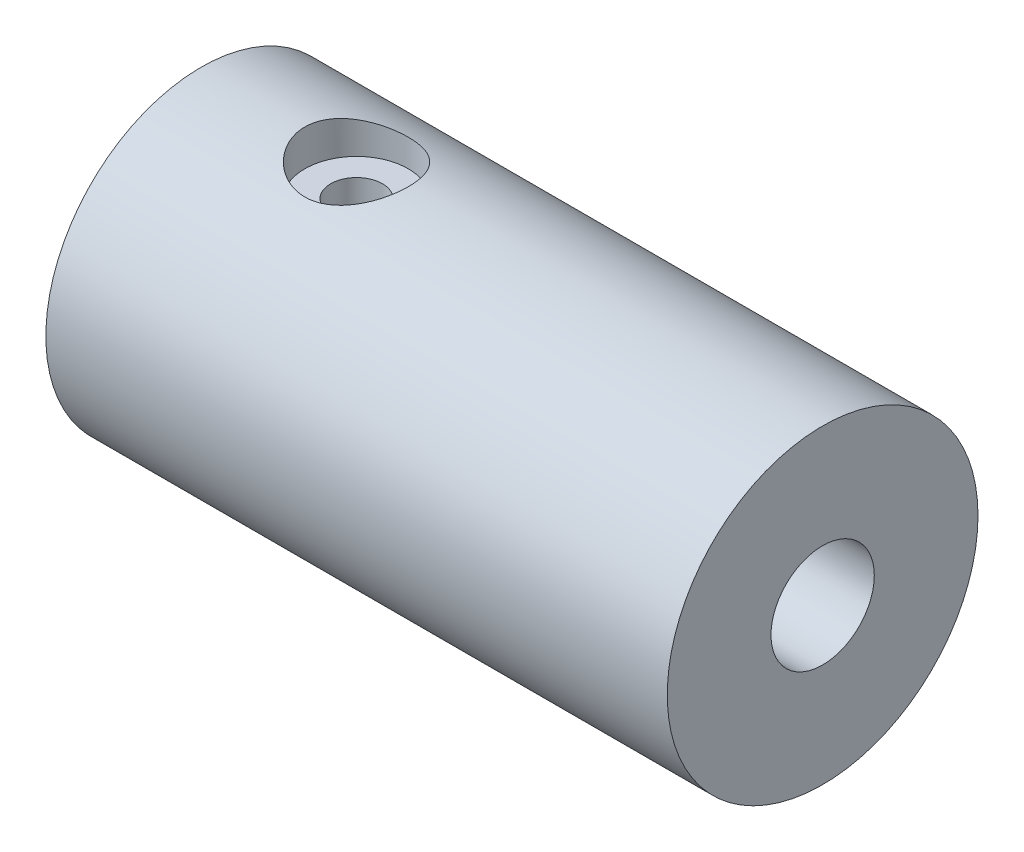
ISO-10303-21;
HEADER;
FILE_DESCRIPTION(('STEP AP214'),'2;1');
FILE_NAME('part.step','',(''),(''),'','','');
FILE_SCHEMA(('AUTOMOTIVE_DESIGN { 1 0 10303 214 1 1 1 1 }'));
ENDSEC;
DATA;
#1=APPLICATION_CONTEXT('core data for automotive mechanical design processes');
#2=APPLICATION_PROTOCOL_DEFINITION('international standard','automotive_design',2000,#1);
#3=PRODUCT_CONTEXT('',#1,'mechanical');
#4=PRODUCT('Part','Part','',(#3));
#5=PRODUCT_RELATED_PRODUCT_CATEGORY('part','',(#4));
#6=PRODUCT_DEFINITION_FORMATION('','',#4);
#7=PRODUCT_DEFINITION_CONTEXT('part definition',#1,'design');
#8=PRODUCT_DEFINITION('design','',#6,#7);
#9=PRODUCT_DEFINITION_SHAPE('','',#8);
#10=(LENGTH_UNIT() NAMED_UNIT(*) SI_UNIT(.MILLI.,.METRE.));
#11=(NAMED_UNIT(*) PLANE_ANGLE_UNIT() SI_UNIT($,.RADIAN.));
#12=(NAMED_UNIT(*) SI_UNIT($,.STERADIAN.) SOLID_ANGLE_UNIT());
#13=UNCERTAINTY_MEASURE_WITH_UNIT(LENGTH_MEASURE(1.E-05),#10,'distance_accuracy_value','');
#14=(GEOMETRIC_REPRESENTATION_CONTEXT(3) GLOBAL_UNCERTAINTY_ASSIGNED_CONTEXT((#13)) GLOBAL_UNIT_ASSIGNED_CONTEXT((#10,
#11,#12)) REPRESENTATION_CONTEXT('',''));
#15=CARTESIAN_POINT('',(0.,0.,0.));
#16=DIRECTION('',(0.,0.,1.));
#17=DIRECTION('',(1.,0.,0.));
#18=AXIS2_PLACEMENT_3D('',#15,#16,#17);
#19=CARTESIAN_POINT('',(12.,0.,0.));
#20=DIRECTION('',(-1.,0.,0.));
#21=DIRECTION('',(0.,0.,1.));
#22=AXIS2_PLACEMENT_3D('',#19,#20,#21);
#23=CYLINDRICAL_SURFACE('',#22,3.);
#24=CARTESIAN_POINT('',(3.,2.82842712474619,1.));
#25=CARTESIAN_POINT('',(2.94553182518932,2.82842694532735,1.0000002579478));
#26=CARTESIAN_POINT('',(2.89106520022848,2.83001769372806,0.99553478369814));
#27=CARTESIAN_POINT('',(2.78374557904939,2.8361757417458,0.977851131702564));
#28=CARTESIAN_POINT('',(2.73089285013606,2.8407435316722,0.964631512170673));
#29=CARTESIAN_POINT('',(2.62837310698719,2.85228203663888,0.929955485680262));
#30=CARTESIAN_POINT('',(2.57870007055312,2.8592480396464,0.908515221402));
#31=CARTESIAN_POINT('',(2.48363995145621,2.87479122017008,0.858061628442627));
#32=CARTESIAN_POINT('',(2.4382538174475,2.88336875305432,0.829046628860522));
#33=CARTESIAN_POINT('',(2.35128003766051,2.90154489405589,0.763051146442527));
#34=CARTESIAN_POINT('',(2.30988457132796,2.91116894844139,0.725824341377825));
#35=CARTESIAN_POINT('',(2.23379319877568,2.93013864801508,0.644987667214489));
#36=CARTESIAN_POINT('',(2.19909836841772,2.93948424829099,0.601376775052402));
#37=CARTESIAN_POINT('',(2.13652110267032,2.95713866921658,0.507604507964984));
#38=CARTESIAN_POINT('',(2.10884002938202,2.96541407701568,0.457301911224518));
#39=CARTESIAN_POINT('',(2.06240841487251,2.9796958677102,0.352431222987481));
#40=CARTESIAN_POINT('',(2.0436554668231,2.98570286203012,0.297864285687214));
#41=CARTESIAN_POINT('',(2.0162641453676,2.99459075431897,0.188028817433492));
#42=CARTESIAN_POINT('',(2.00729655374299,2.99757314777558,0.132850754852967));
#43=CARTESIAN_POINT('',(1.99868370663934,3.00043608218249,0.0216978748240911));
#44=CARTESIAN_POINT('',(1.99903604834758,3.00031742262891,-0.0342767335438929));
#45=CARTESIAN_POINT('',(2.00884425456603,2.99706039618736,-0.143103515193817));
#46=CARTESIAN_POINT('',(2.01794252847451,2.99404064755135,-0.195992048591667));
#47=CARTESIAN_POINT('',(2.04439298098046,2.98546967339714,-0.29944343882216));
#48=CARTESIAN_POINT('',(2.06174571897976,2.97991827631115,-0.350006137779175));
#49=CARTESIAN_POINT('',(2.10442131730613,2.96675670293292,-0.448152474842013));
#50=CARTESIAN_POINT('',(2.12984593854678,2.9591204252427,-0.495688220968998));
#51=CARTESIAN_POINT('',(2.18785970544839,2.94258393038665,-0.585924325527169));
#52=CARTESIAN_POINT('',(2.22045084332664,2.93368336200518,-0.628623334384769));
#53=CARTESIAN_POINT('',(2.29367439346074,2.9150619185089,-0.710100866551906));
#54=CARTESIAN_POINT('',(2.33461315784544,2.90532215172667,-0.748600157067556));
#55=CARTESIAN_POINT('',(2.42244872572266,2.88647335245111,-0.81827725959589));
#56=CARTESIAN_POINT('',(2.46934644571324,2.8773644173145,-0.849453943273005));
#57=CARTESIAN_POINT('',(2.56865362561542,2.86070525135531,-0.903987455042732));
#58=CARTESIAN_POINT('',(2.62113213136781,2.85317909338821,-0.927226463651049));
#59=CARTESIAN_POINT('',(2.72957139426626,2.84081650878299,-0.964443193299506));
#60=CARTESIAN_POINT('',(2.78553068122183,2.83597895501223,-0.978424795755529));
#61=CARTESIAN_POINT('',(2.89663835540062,2.8297963630207,-0.996161282090474));
#62=CARTESIAN_POINT('',(2.95170942474572,2.82830360315139,-1.00034909550575));
#63=CARTESIAN_POINT('',(3.06177614911704,2.82856672062801,-0.999605438911604));
#64=CARTESIAN_POINT('',(3.11677181602476,2.83032200792768,-0.99467562522726));
#65=CARTESIAN_POINT('',(3.22315696571116,2.83673618089379,-0.97622565155183));
#66=CARTESIAN_POINT('',(3.27460543015064,2.84129325440593,-0.963006393980555));
#67=CARTESIAN_POINT('',(3.37454360623938,2.8526855367127,-0.928713862560596));
#68=CARTESIAN_POINT('',(3.42303279159084,2.85952114934907,-0.907639196363457));
#69=CARTESIAN_POINT('',(3.51738042084694,2.87496877595718,-0.857474340738901));
#70=CARTESIAN_POINT('',(3.56310664264179,2.8836302566561,-0.828151118358487));
#71=CARTESIAN_POINT('',(3.64914605238373,2.90165768730984,-0.762585630557568));
#72=CARTESIAN_POINT('',(3.68945763866122,2.911023844438,-0.726341325498785));
#73=CARTESIAN_POINT('',(3.76552798409064,2.92995038637844,-0.645891705900322));
#74=CARTESIAN_POINT('',(3.80097439001885,2.93949843577895,-0.601387270546651));
#75=CARTESIAN_POINT('',(3.86391614234805,2.9572685161311,-0.506827291400257));
#76=CARTESIAN_POINT('',(3.89141177116243,2.96549059417695,-0.456771944864552));
#77=CARTESIAN_POINT('',(3.93742010486172,2.97964405810603,-0.352779862432295));
#78=CARTESIAN_POINT('',(3.95599127714807,2.98559030004531,-0.298871123321196));
#79=CARTESIAN_POINT('',(3.98372774206011,2.99458610837774,-0.188458465846016));
#80=CARTESIAN_POINT('',(3.9928964298805,2.99763672034018,-0.131955491953889));
#81=CARTESIAN_POINT('',(4.00126207760564,3.00041863236257,-0.0208153358600408));
#82=CARTESIAN_POINT('',(4.00090745393238,3.00029920089441,0.033784723920019));
#83=CARTESIAN_POINT('',(3.99134269185359,2.99712196519396,0.142111145000174));
#84=CARTESIAN_POINT('',(3.98213327184724,2.99406439933567,0.195837576819055));
#85=CARTESIAN_POINT('',(3.95541776542403,2.98540914954421,0.300042119432061));
#86=CARTESIAN_POINT('',(3.93804578464705,2.9798525836118,0.350558270912795));
#87=CARTESIAN_POINT('',(3.89562246890286,2.96677160704464,0.44797835093979));
#88=CARTESIAN_POINT('',(3.87056974480306,2.95924684047901,0.49488162414241));
#89=CARTESIAN_POINT('',(3.81243048789792,2.94265868828001,0.585634016308809));
#90=CARTESIAN_POINT('',(3.77908131461808,2.93354872492381,0.629306251557697));
#91=CARTESIAN_POINT('',(3.70574260884409,2.91492988791425,0.710581026272338));
#92=CARTESIAN_POINT('',(3.66575095773832,2.90542088771397,0.748181621624259));
#93=CARTESIAN_POINT('',(3.57839064441196,2.88663279827365,0.817741808833464));
#94=CARTESIAN_POINT('',(3.53079448901923,2.87737727995345,0.849422965999216));
#95=CARTESIAN_POINT('',(3.43066557310135,2.86060193316303,0.904314343299799));
#96=CARTESIAN_POINT('',(3.37813410698576,2.8530816513617,0.927526776814559));
#97=CARTESIAN_POINT('',(3.27203817597617,2.84101334230535,0.963843828206626));
#98=CARTESIAN_POINT('',(3.21862773643428,2.83634632944799,0.977357909163267));
#99=CARTESIAN_POINT('',(3.11014394948453,2.8300538361394,0.995434320161694));
#100=CARTESIAN_POINT('',(3.05507118256425,2.82842730615135,0.999999739196501));
#101=CARTESIAN_POINT('',(3.,2.82842712474619,1.));
#102=B_SPLINE_CURVE_WITH_KNOTS('',3,(#24,#25,#26,#27,#28,#29,#30,#31,#32,#33,#34,#35,#36,#37,
#38,#39,#40,#41,#42,#43,#44,#45,#46,#47,#48,#49,#50,#51,#52,#53,#54,#55,#56,#57,#58,#59,#60,#61,
#62,#63,#64,#65,#66,#67,#68,#69,#70,#71,#72,#73,#74,#75,#76,#77,#78,#79,#80,#81,#82,#83,#84,#85,
#86,#87,#88,#89,#90,#91,#92,#93,#94,#95,#96,#97,#98,#99,#100,#101),.UNSPECIFIED.,.T.,.F.,(4,2,2,
2,2,2,2,2,2,2,2,2,2,2,2,2,2,2,2,2,2,2,2,2,2,2,2,2,2,2,2,2,2,2,2,2,2,2,4),(0.,0.163200584775416,
0.32642805496888,0.489336627454544,0.652281166139158,0.821013374229397,0.989772651673595,
1.16293506139029,1.33605076382161,1.50314318760306,1.67019253297699,1.83069004820941,
1.99119844184608,2.15381654855707,2.31647991869394,2.48680174359289,2.65714979607477,
2.82992639837376,3.00263051349688,3.16754291357512,3.33242535830306,3.49164395761849,
3.65089079140018,3.81518857728788,3.979534856552,4.15178808164165,4.32403518750605,
4.49513791183924,4.66617882997229,4.82918084670708,4.99216964002854,5.15256956033502,
5.31299850756315,5.47935519513706,5.64576504425704,5.81868902729217,5.99156778259939,
6.15663212153685,6.32163947179229),.UNSPECIFIED.);
#103=CARTESIAN_POINT('',(3.,2.82842712474619,1.));
#104=VERTEX_POINT('',#103);
#105=EDGE_CURVE('E10',#104,#104,#102,.T.);
#106=ORIENTED_EDGE('',*,*,#105,.T.);
#107=EDGE_LOOP('',(#106));
#108=FACE_BOUND('',#107,.T.);
#109=CARTESIAN_POINT('',(12.,0.,0.));
#110=DIRECTION('',(1.,0.,0.));
#111=DIRECTION('',(0.,0.,-1.));
#112=AXIS2_PLACEMENT_3D('',#109,#110,#111);
#113=CIRCLE('',#112,3.);
#114=CARTESIAN_POINT('',(12.,0.,-3.));
#115=VERTEX_POINT('',#114);
#116=EDGE_CURVE('E41',#115,#115,#113,.T.);
#117=ORIENTED_EDGE('',*,*,#116,.F.);
#118=EDGE_LOOP('',(#117));
#119=FACE_BOUND('',#118,.T.);
#120=CARTESIAN_POINT('',(0.,0.,0.));
#121=DIRECTION('',(1.,0.,0.));
#122=DIRECTION('',(0.,0.,-1.));
#123=AXIS2_PLACEMENT_3D('',#120,#121,#122);
#124=CIRCLE('',#123,3.);
#125=CARTESIAN_POINT('',(0.,0.,-3.));
#126=VERTEX_POINT('',#125);
#127=EDGE_CURVE('E45',#126,#126,#124,.T.);
#128=ORIENTED_EDGE('',*,*,#127,.T.);
#129=EDGE_LOOP('',(#128));
#130=FACE_BOUND('',#129,.T.);
#131=ADVANCED_FACE('F31',(#108,#119,#130),#23,.T.);
#132=CARTESIAN_POINT('',(12.,0.,0.));
#133=DIRECTION('',(1.,0.,0.));
#134=DIRECTION('',(0.,0.,-1.));
#135=AXIS2_PLACEMENT_3D('',#132,#133,#134);
#136=PLANE('',#135);
#137=CARTESIAN_POINT('',(12.,0.,0.));
#138=DIRECTION('',(1.,0.,0.));
#139=DIRECTION('',(0.,0.,-1.));
#140=AXIS2_PLACEMENT_3D('',#137,#138,#139);
#141=CIRCLE('',#140,0.9975);
#142=CARTESIAN_POINT('',(12.,0.,-0.9975));
#143=VERTEX_POINT('',#142);
#144=EDGE_CURVE('E126',#143,#143,#141,.T.);
#145=ORIENTED_EDGE('',*,*,#144,.F.);
#146=EDGE_LOOP('',(#145));
#147=FACE_BOUND('',#146,.T.);
#148=ORIENTED_EDGE('',*,*,#116,.T.);
#149=EDGE_LOOP('',(#148));
#150=FACE_BOUND('',#149,.T.);
#151=ADVANCED_FACE('F85',(#147,#150),#136,.T.);
#152=CARTESIAN_POINT('',(0.,0.,0.));
#153=DIRECTION('',(1.,0.,0.));
#154=DIRECTION('',(0.,0.,-1.));
#155=AXIS2_PLACEMENT_3D('',#152,#153,#154);
#156=PLANE('',#155);
#157=CARTESIAN_POINT('',(0.,0.,0.));
#158=DIRECTION('',(1.,0.,0.));
#159=DIRECTION('',(0.,0.,-1.));
#160=AXIS2_PLACEMENT_3D('',#157,#158,#159);
#161=CIRCLE('',#160,1.095);
#162=CARTESIAN_POINT('',(0.,0.,-1.095));
#163=VERTEX_POINT('',#162);
#164=EDGE_CURVE('E52',#163,#163,#161,.T.);
#165=ORIENTED_EDGE('',*,*,#164,.T.);
#166=EDGE_LOOP('',(#165));
#167=FACE_BOUND('',#166,.T.);
#168=ORIENTED_EDGE('',*,*,#127,.F.);
#169=EDGE_LOOP('',(#168));
#170=FACE_BOUND('',#169,.T.);
#171=ADVANCED_FACE('F89',(#167,#170),#156,.F.);
#172=CARTESIAN_POINT('',(7.,0.,0.));
#173=DIRECTION('',(-1.,0.,0.));
#174=DIRECTION('',(0.,0.,1.));
#175=AXIS2_PLACEMENT_3D('',#172,#173,#174);
#176=CYLINDRICAL_SURFACE('',#175,1.095);
#177=CARTESIAN_POINT('',(3.,0.974179141636691,0.5));
#178=CARTESIAN_POINT('',(3.02638822465866,0.974180750905902,0.499998574725631));
#179=CARTESIAN_POINT('',(3.05281727708981,0.975267072640299,0.497897521915498));
#180=CARTESIAN_POINT('',(3.10489059713055,0.979463536568607,0.489588295549626));
#181=CARTESIAN_POINT('',(3.13053278270973,0.982578632075,0.48337006916996));
#182=CARTESIAN_POINT('',(3.18018421777573,0.990400092743193,0.467132408772783));
#183=CARTESIAN_POINT('',(3.20420043742149,0.995099070709478,0.457130595317162));
#184=CARTESIAN_POINT('',(3.25020807975825,1.00554760028066,0.433662814740286));
#185=CARTESIAN_POINT('',(3.27219970177655,1.01129704829714,0.420197189137347));
#186=CARTESIAN_POINT('',(3.31519663909436,1.02368023988367,0.389104103471685));
#187=CARTESIAN_POINT('',(3.33603240895957,1.030347550122,0.371255443402939));
#188=CARTESIAN_POINT('',(3.37454318608931,1.04354195414476,0.33236542326345));
#189=CARTESIAN_POINT('',(3.39221682325204,1.05006898607631,0.311322686513762));
#190=CARTESIAN_POINT('',(3.42482981126807,1.0626696499725,0.265250753406823));
#191=CARTESIAN_POINT('',(3.43957019851688,1.06869982143658,0.240067731665804));
#192=CARTESIAN_POINT('',(3.46452978299303,1.07920538532467,0.187253253920853));
#193=CARTESIAN_POINT('',(3.47475137157989,1.08368159983661,0.159623102259618));
#194=CARTESIAN_POINT('',(3.4897429665312,1.09033522237584,0.104486548971829));
#195=CARTESIAN_POINT('',(3.49480758907378,1.09263624503856,0.077075490876996));
#196=CARTESIAN_POINT('',(3.50030186923697,1.09513495746004,0.0217028817307119));
#197=CARTESIAN_POINT('',(3.50073381556526,1.09533368582668,-0.00625839065413278));
#198=CARTESIAN_POINT('',(3.49708640475643,1.09367181552035,-0.0597627493032363));
#199=CARTESIAN_POINT('',(3.49333329125184,1.09196013282863,-0.0853336483603504));
#200=CARTESIAN_POINT('',(3.4819927411667,1.08688379677531,-0.135435757394683));
#201=CARTESIAN_POINT('',(3.47440502019863,1.08351902081522,-0.159966890113021));
#202=CARTESIAN_POINT('',(3.45553429140653,1.07538975771208,-0.207746362255662));
#203=CARTESIAN_POINT('',(3.44419721371426,1.07060490171592,-0.230969737507867));
#204=CARTESIAN_POINT('',(3.41821026117504,1.06008668856438,-0.275244987389664));
#205=CARTESIAN_POINT('',(3.40355917227342,1.05435298401501,-0.296296062092938));
#206=CARTESIAN_POINT('',(3.3699682937268,1.04193975197126,-0.337470177317117));
#207=CARTESIAN_POINT('',(3.35077508503873,1.03522121977659,-0.357374967816835));
#208=CARTESIAN_POINT('',(3.30934039583814,1.02192545680425,-0.393789163683032));
#209=CARTESIAN_POINT('',(3.28709724308047,1.01534830584847,-0.41029669387138));
#210=CARTESIAN_POINT('',(3.23892315702262,1.00276875353325,-0.440176182427495));
#211=CARTESIAN_POINT('',(3.21286971418025,0.996806663479741,-0.453369149826456));
#212=CARTESIAN_POINT('',(3.15856928845524,0.986641578405134,-0.475088210680067));
#213=CARTESIAN_POINT('',(3.13032425632833,0.982437039790755,-0.483618401316079));
#214=CARTESIAN_POINT('',(3.07463266900552,0.976670627780376,-0.495154970001792));
#215=CARTESIAN_POINT('',(3.04727837108229,0.974938228537521,-0.498519165408573));
#216=CARTESIAN_POINT('',(2.99234706007137,0.97382296088193,-0.500695439192079));
#217=CARTESIAN_POINT('',(2.96477016043159,0.974438962809743,-0.499509706234623));
#218=CARTESIAN_POINT('',(2.91261864085833,0.977772296444088,-0.492947623422435));
#219=CARTESIAN_POINT('',(2.88798575411881,0.980309665570744,-0.487929868699457));
#220=CARTESIAN_POINT('',(2.83994310711023,0.986953078638363,-0.474347272059063));
#221=CARTESIAN_POINT('',(2.81653367652506,0.991059542949971,-0.465781479547892));
#222=CARTESIAN_POINT('',(2.7704038597193,1.00060295485654,-0.444921928119587));
#223=CARTESIAN_POINT('',(2.74776331061569,1.00609194557488,-0.43247625682193));
#224=CARTESIAN_POINT('',(2.70477086132621,1.0177209983775,-0.404351782684865));
#225=CARTESIAN_POINT('',(2.68442007665598,1.02386137499482,-0.388671414431959));
#226=CARTESIAN_POINT('',(2.64443206713985,1.03685113481661,-0.35265660612355));
#227=CARTESIAN_POINT('',(2.62507625888129,1.04370929659735,-0.332011524271317));
#228=CARTESIAN_POINT('',(2.59003571587075,1.05680235825521,-0.287626101932216));
#229=CARTESIAN_POINT('',(2.5743516318776,1.06303714753676,-0.263885213918687));
#230=CARTESIAN_POINT('',(2.5469784215689,1.07428848197202,-0.213544594717163));
#231=CARTESIAN_POINT('',(2.53533838074544,1.07928985842348,-0.186914560734961));
#232=CARTESIAN_POINT('',(2.51680505081251,1.08739703073512,-0.131782674589937));
#233=CARTESIAN_POINT('',(2.50990830779315,1.09050420570138,-0.103282201019284));
#234=CARTESIAN_POINT('',(2.50155338559932,1.09428590425815,-0.0477063605085775));
#235=CARTESIAN_POINT('',(2.49970062840743,1.09513677564247,-0.0207020382108466));
#236=CARTESIAN_POINT('',(2.5003779305783,1.09482735381087,0.0332364724075883));
#237=CARTESIAN_POINT('',(2.50290691667807,1.09366755308839,0.060170676284782));
#238=CARTESIAN_POINT('',(2.51199683969249,1.08956732123947,0.111838132922575));
#239=CARTESIAN_POINT('',(2.51835557654847,1.08671628937673,0.136614707583917));
#240=CARTESIAN_POINT('',(2.53468080406552,1.0795801115154,0.184726082984068));
#241=CARTESIAN_POINT('',(2.54464790237294,1.07529472398116,0.208060640112528));
#242=CARTESIAN_POINT('',(2.56840356791205,1.06544754710075,0.253809092731155));
#243=CARTESIAN_POINT('',(2.58234592275497,1.05983638752949,0.276132219156975));
#244=CARTESIAN_POINT('',(2.61344938725283,1.047969387116,0.318220215974281));
#245=CARTESIAN_POINT('',(2.63061191164204,1.04171326346464,0.337983955461549));
#246=CARTESIAN_POINT('',(2.66934455742386,1.02859077956524,0.376119527268074));
#247=CARTESIAN_POINT('',(2.69116301425495,1.02171707325466,0.394237451721866));
#248=CARTESIAN_POINT('',(2.73770150349477,1.00862667728491,0.426618358320279));
#249=CARTESIAN_POINT('',(2.76242345551111,1.00241042751394,0.440878769309656));
#250=CARTESIAN_POINT('',(2.81443600455831,0.991366862053861,0.4651853282357));
#251=CARTESIAN_POINT('',(2.84174739990415,0.986552326774882,0.47519305864909));
#252=CARTESIAN_POINT('',(2.89792538462866,0.979120640047078,0.490327408389469));
#253=CARTESIAN_POINT('',(2.92678640490965,0.976496115790155,0.495470412993606));
#254=CARTESIAN_POINT('',(2.9632113452157,0.974845488000344,0.49869956084772));
#255=CARTESIAN_POINT('',(2.97055736139513,0.974596201760226,0.499186696631167));
#256=CARTESIAN_POINT('',(2.98526785703132,0.974262800830847,0.49983712123877));
#257=CARTESIAN_POINT('',(2.99263233716888,0.974178692324428,0.500000397940412));
#258=CARTESIAN_POINT('',(3.,0.974179141636691,0.5));
#259=B_SPLINE_CURVE_WITH_KNOTS('',3,(#177,#178,#179,#180,#181,#182,#183,#184,#185,#186,#187,
#188,#189,#190,#191,#192,#193,#194,#195,#196,#197,#198,#199,#200,#201,#202,#203,#204,#205,#206,
#207,#208,#209,#210,#211,#212,#213,#214,#215,#216,#217,#218,#219,#220,#221,#222,#223,#224,#225,
#226,#227,#228,#229,#230,#231,#232,#233,#234,#235,#236,#237,#238,#239,#240,#241,#242,#243,#244,
#245,#246,#247,#248,#249,#250,#251,#252,#253,#254,#255,#256,#257,#258),.UNSPECIFIED.,.T.,.F.,(4,
2,2,2,2,2,2,2,2,2,2,2,2,2,2,2,2,2,2,2,2,2,2,2,2,2,2,2,2,2,2,2,2,2,2,2,2,2,2,2,4),(0.,
0.0791336960983262,0.158461327500133,0.237423981296809,0.316378852667077,0.40071826806931,
0.485094138366685,0.574022230948818,0.662903206062703,0.746360238986163,0.829776039251371,
0.90711710680244,0.984463911071841,1.06297867692159,1.14152225258381,1.22651722066574,
1.31155897814087,1.40050945355648,1.48938164203892,1.57176540413633,1.65410954189227,
1.72957022533333,1.80505113936512,1.88396702996733,1.96292120144622,2.04987831887332,
2.13685083651506,2.22484486975321,2.312774760664,2.39359649152361,2.47439842872904,
2.55126821862021,2.62815095937361,2.70854625522719,2.78897695463186,2.87612166124274,
2.96332431024127,3.05129878827609,3.13897588600085,3.16106939841147,3.18316373779863),.UNSPECIFIED.);
#260=CARTESIAN_POINT('',(3.,0.974179141636691,0.5));
#261=VERTEX_POINT('',#260);
#262=EDGE_CURVE('E60',#261,#261,#259,.T.);
#263=ORIENTED_EDGE('',*,*,#262,.T.);
#264=EDGE_LOOP('',(#263));
#265=FACE_BOUND('',#264,.T.);
#266=CARTESIAN_POINT('',(7.,0.,0.));
#267=DIRECTION('',(1.,0.,0.));
#268=DIRECTION('',(0.,0.,-1.));
#269=AXIS2_PLACEMENT_3D('',#266,#267,#268);
#270=CIRCLE('',#269,1.095);
#271=CARTESIAN_POINT('',(7.,0.,-1.095));
#272=VERTEX_POINT('',#271);
#273=EDGE_CURVE('E50',#272,#272,#270,.T.);
#274=ORIENTED_EDGE('',*,*,#273,.T.);
#275=EDGE_LOOP('',(#274));
#276=FACE_BOUND('',#275,.T.);
#277=ORIENTED_EDGE('',*,*,#164,.F.);
#278=EDGE_LOOP('',(#277));
#279=FACE_BOUND('',#278,.T.);
#280=ADVANCED_FACE('F97',(#265,#276,#279),#176,.F.);
#281=CARTESIAN_POINT('',(7.,0.,0.));
#282=DIRECTION('',(1.,0.,0.));
#283=DIRECTION('',(0.,0.,-1.));
#284=AXIS2_PLACEMENT_3D('',#281,#282,#283);
#285=PLANE('',#284);
#286=ORIENTED_EDGE('',*,*,#273,.F.);
#287=EDGE_LOOP('',(#286));
#288=FACE_BOUND('',#287,.T.);
#289=ADVANCED_FACE('F102',(#288),#285,.F.);
#290=CARTESIAN_POINT('',(3.,2.3,0.));
#291=DIRECTION('',(0.,1.,0.));
#292=DIRECTION('',(0.,0.,1.));
#293=AXIS2_PLACEMENT_3D('',#290,#291,#292);
#294=CYLINDRICAL_SURFACE('',#293,1.);
#295=CARTESIAN_POINT('',(3.,2.3,0.));
#296=DIRECTION('',(0.,1.,0.));
#297=DIRECTION('',(0.,0.,1.));
#298=AXIS2_PLACEMENT_3D('',#295,#296,#297);
#299=CIRCLE('',#298,1.);
#300=CARTESIAN_POINT('',(3.,2.3,1.));
#301=VERTEX_POINT('',#300);
#302=EDGE_CURVE('E55',#301,#301,#299,.T.);
#303=ORIENTED_EDGE('',*,*,#302,.F.);
#304=EDGE_LOOP('',(#303));
#305=FACE_BOUND('',#304,.T.);
#306=ORIENTED_EDGE('',*,*,#105,.F.);
#307=EDGE_LOOP('',(#306));
#308=FACE_BOUND('',#307,.T.);
#309=ADVANCED_FACE('F107',(#305,#308),#294,.F.);
#310=CARTESIAN_POINT('',(3.,2.3,0.));
#311=DIRECTION('',(0.,1.,0.));
#312=DIRECTION('',(0.,0.,1.));
#313=AXIS2_PLACEMENT_3D('',#310,#311,#312);
#314=PLANE('',#313);
#315=CARTESIAN_POINT('',(3.,2.3,0.));
#316=DIRECTION('',(0.,1.,0.));
#317=DIRECTION('',(0.,0.,1.));
#318=AXIS2_PLACEMENT_3D('',#315,#316,#317);
#319=CIRCLE('',#318,0.5);
#320=CARTESIAN_POINT('',(3.,2.3,0.5));
#321=VERTEX_POINT('',#320);
#322=EDGE_CURVE('E67',#321,#321,#319,.F.);
#323=ORIENTED_EDGE('',*,*,#322,.T.);
#324=EDGE_LOOP('',(#323));
#325=FACE_BOUND('',#324,.T.);
#326=ORIENTED_EDGE('',*,*,#302,.T.);
#327=EDGE_LOOP('',(#326));
#328=FACE_BOUND('',#327,.T.);
#329=ADVANCED_FACE('F111',(#325,#328),#314,.T.);
#330=CARTESIAN_POINT('',(3.,-3.001,0.));
#331=DIRECTION('',(0.,1.,0.));
#332=DIRECTION('',(0.,0.,1.));
#333=AXIS2_PLACEMENT_3D('',#330,#331,#332);
#334=CYLINDRICAL_SURFACE('',#333,0.5);
#335=ORIENTED_EDGE('',*,*,#262,.F.);
#336=EDGE_LOOP('',(#335));
#337=FACE_BOUND('',#336,.T.);
#338=ORIENTED_EDGE('',*,*,#322,.F.);
#339=EDGE_LOOP('',(#338));
#340=FACE_BOUND('',#339,.T.);
#341=ADVANCED_FACE('F69',(#337,#340),#334,.F.);
#342=CARTESIAN_POINT('',(9.,0.,0.));
#343=DIRECTION('',(1.,0.,0.));
#344=DIRECTION('',(0.,0.,-1.));
#345=AXIS2_PLACEMENT_3D('',#342,#343,#344);
#346=CYLINDRICAL_SURFACE('',#345,0.9975);
#347=CARTESIAN_POINT('',(9.,0.,0.));
#348=DIRECTION('',(1.,0.,0.));
#349=DIRECTION('',(0.,0.,-1.));
#350=AXIS2_PLACEMENT_3D('',#347,#348,#349);
#351=CIRCLE('',#350,0.9975);
#352=CARTESIAN_POINT('',(9.,0.,-0.9975));
#353=VERTEX_POINT('',#352);
#354=EDGE_CURVE('E125',#353,#353,#351,.T.);
#355=ORIENTED_EDGE('',*,*,#354,.F.);
#356=EDGE_LOOP('',(#355));
#357=FACE_BOUND('',#356,.T.);
#358=ORIENTED_EDGE('',*,*,#144,.T.);
#359=EDGE_LOOP('',(#358));
#360=FACE_BOUND('',#359,.T.);
#361=ADVANCED_FACE('F74',(#357,#360),#346,.F.);
#362=CARTESIAN_POINT('',(9.,0.,0.));
#363=DIRECTION('',(1.,0.,0.));
#364=DIRECTION('',(0.,0.,-1.));
#365=AXIS2_PLACEMENT_3D('',#362,#363,#364);
#366=PLANE('',#365);
#367=ORIENTED_EDGE('',*,*,#354,.T.);
#368=EDGE_LOOP('',(#367));
#369=FACE_BOUND('',#368,.T.);
#370=ADVANCED_FACE('F77',(#369),#366,.T.);
#371=CLOSED_SHELL('',(#131,#151,#171,#280,#289,#309,#329,#341,#361,#370));
#372=MANIFOLD_SOLID_BREP('B2',#371);
#373=ADVANCED_BREP_SHAPE_REPRESENTATION('',(#18,#372),#14);
#374=SHAPE_DEFINITION_REPRESENTATION(#9,#373);
ENDSEC;
END-ISO-10303-21;
